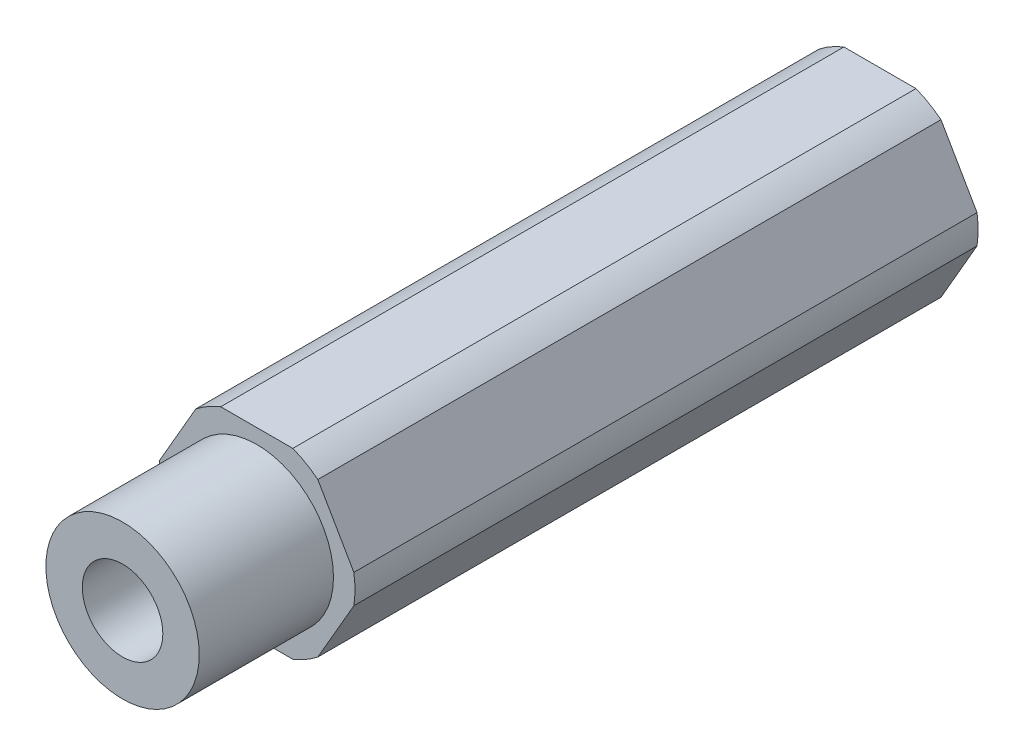
ISO-10303-21;
HEADER;
FILE_DESCRIPTION(('STEP AP214'),'2;1');
FILE_NAME('part.step','',(''),(''),'','','');
FILE_SCHEMA(('AUTOMOTIVE_DESIGN { 1 0 10303 214 1 1 1 1 }'));
ENDSEC;
DATA;
#1=APPLICATION_CONTEXT('core data for automotive mechanical design processes');
#2=APPLICATION_PROTOCOL_DEFINITION('international standard','automotive_design',2000,#1);
#3=PRODUCT_CONTEXT('',#1,'mechanical');
#4=PRODUCT('Part','Part','',(#3));
#5=PRODUCT_RELATED_PRODUCT_CATEGORY('part','',(#4));
#6=PRODUCT_DEFINITION_FORMATION('','',#4);
#7=PRODUCT_DEFINITION_CONTEXT('part definition',#1,'design');
#8=PRODUCT_DEFINITION('design','',#6,#7);
#9=PRODUCT_DEFINITION_SHAPE('','',#8);
#10=(LENGTH_UNIT() NAMED_UNIT(*) SI_UNIT(.MILLI.,.METRE.));
#11=(NAMED_UNIT(*) PLANE_ANGLE_UNIT() SI_UNIT($,.RADIAN.));
#12=(NAMED_UNIT(*) SI_UNIT($,.STERADIAN.) SOLID_ANGLE_UNIT());
#13=UNCERTAINTY_MEASURE_WITH_UNIT(LENGTH_MEASURE(1.E-05),#10,'distance_accuracy_value','');
#14=(GEOMETRIC_REPRESENTATION_CONTEXT(3) GLOBAL_UNCERTAINTY_ASSIGNED_CONTEXT((#13)) GLOBAL_UNIT_ASSIGNED_CONTEXT((#10,
#11,#12)) REPRESENTATION_CONTEXT('',''));
#15=CARTESIAN_POINT('',(0.,0.,0.));
#16=DIRECTION('',(0.,0.,1.));
#17=DIRECTION('',(1.,0.,0.));
#18=AXIS2_PLACEMENT_3D('',#15,#16,#17);
#19=CARTESIAN_POINT('',(0.,0.,39.5));
#20=DIRECTION('',(0.,0.,1.));
#21=DIRECTION('',(1.,0.,0.));
#22=AXIS2_PLACEMENT_3D('',#19,#20,#21);
#23=PLANE('',#22);
#24=CARTESIAN_POINT('',(0.,0.,39.5));
#25=DIRECTION('',(0.,0.,1.));
#26=DIRECTION('',(1.,0.,0.));
#27=AXIS2_PLACEMENT_3D('',#24,#25,#26);
#28=CIRCLE('',#27,2.1);
#29=CARTESIAN_POINT('',(2.1,0.,39.5));
#30=VERTEX_POINT('',#29);
#31=EDGE_CURVE('E234',#30,#30,#28,.F.);
#32=ORIENTED_EDGE('',*,*,#31,.T.);
#33=EDGE_LOOP('',(#32));
#34=FACE_BOUND('',#33,.T.);
#35=CARTESIAN_POINT('',(0.,0.,39.5));
#36=DIRECTION('',(0.,0.,1.));
#37=DIRECTION('',(1.,0.,0.));
#38=AXIS2_PLACEMENT_3D('',#35,#36,#37);
#39=CIRCLE('',#38,4.);
#40=CARTESIAN_POINT('',(4.,0.,39.5));
#41=VERTEX_POINT('',#40);
#42=EDGE_CURVE('E279',#41,#41,#39,.T.);
#43=ORIENTED_EDGE('',*,*,#42,.T.);
#44=EDGE_LOOP('',(#43));
#45=FACE_BOUND('',#44,.T.);
#46=ADVANCED_FACE('F56',(#34,#45),#23,.T.);
#47=CARTESIAN_POINT('',(0.,0.,-457.2));
#48=DIRECTION('',(0.,0.,1.));
#49=DIRECTION('',(1.,0.,0.));
#50=AXIS2_PLACEMENT_3D('',#47,#48,#49);
#51=CYLINDRICAL_SURFACE('',#50,5.12);
#52=DIRECTION('',(0.,0.,1.));
#53=VECTOR('',#52,1.);
#54=CARTESIAN_POINT('',(5.06425896558911,0.753446168913412,-457.2));
#55=LINE('',#54,#53);
#56=CARTESIAN_POINT('',(5.06425896558911,0.753446168913412,0.));
#57=VERTEX_POINT('',#56);
#58=CARTESIAN_POINT('',(5.06425896558912,0.753446168913413,32.5));
#59=VERTEX_POINT('',#58);
#60=EDGE_CURVE('E164',#57,#59,#55,.T.);
#61=ORIENTED_EDGE('',*,*,#60,.T.);
#62=CARTESIAN_POINT('',(0.,0.,32.5));
#63=DIRECTION('',(0.,0.,1.));
#64=DIRECTION('',(1.,0.,0.));
#65=AXIS2_PLACEMENT_3D('',#62,#63,#64);
#66=CIRCLE('',#65,5.12000000000001);
#67=CARTESIAN_POINT('',(5.0642589655891,-0.753446168913538,32.5));
#68=VERTEX_POINT('',#67);
#69=EDGE_CURVE('E145',#68,#59,#66,.T.);
#70=ORIENTED_EDGE('',*,*,#69,.F.);
#71=DIRECTION('',(0.,0.,-1.));
#72=VECTOR('',#71,1.);
#73=CARTESIAN_POINT('',(5.06425896558911,-0.753446168913433,-457.2));
#74=LINE('',#73,#72);
#75=CARTESIAN_POINT('',(5.06425896558911,-0.753446168913433,0.));
#76=VERTEX_POINT('',#75);
#77=EDGE_CURVE('E65',#68,#76,#74,.T.);
#78=ORIENTED_EDGE('',*,*,#77,.T.);
#79=CARTESIAN_POINT('',(0.,0.,0.));
#80=DIRECTION('',(0.,0.,1.));
#81=DIRECTION('',(1.,0.,0.));
#82=AXIS2_PLACEMENT_3D('',#79,#80,#81);
#83=CIRCLE('',#82,5.12);
#84=EDGE_CURVE('E173',#57,#76,#83,.F.);
#85=ORIENTED_EDGE('',*,*,#84,.F.);
#86=EDGE_LOOP('',(#61,#70,#78,#85));
#87=FACE_BOUND('',#86,.T.);
#88=ADVANCED_FACE('F171',(#87),#51,.T.);
#89=CARTESIAN_POINT('',(0.,0.,-457.2));
#90=DIRECTION('',(0.,0.,1.));
#91=DIRECTION('',(1.,0.,0.));
#92=AXIS2_PLACEMENT_3D('',#89,#90,#91);
#93=CYLINDRICAL_SURFACE('',#92,5.12);
#94=DIRECTION('',(0.,0.,1.));
#95=VECTOR('',#94,1.);
#96=CARTESIAN_POINT('',(3.1846330054577,-4.00905383108652,-457.2));
#97=LINE('',#96,#95);
#98=CARTESIAN_POINT('',(3.1846330054577,-4.00905383108652,0.));
#99=VERTEX_POINT('',#98);
#100=CARTESIAN_POINT('',(3.18463300545775,-4.00905383108648,32.5));
#101=VERTEX_POINT('',#100);
#102=EDGE_CURVE('E175',#99,#101,#97,.T.);
#103=ORIENTED_EDGE('',*,*,#102,.T.);
#104=CARTESIAN_POINT('',(1.87962596013157,-4.76249999999995,32.5));
#105=VERTEX_POINT('',#104);
#106=EDGE_CURVE('E156',#105,#101,#66,.T.);
#107=ORIENTED_EDGE('',*,*,#106,.F.);
#108=DIRECTION('',(0.,0.,-1.));
#109=VECTOR('',#108,1.);
#110=CARTESIAN_POINT('',(1.87962596013154,-4.7625,-457.2));
#111=LINE('',#110,#109);
#112=CARTESIAN_POINT('',(1.87962596013154,-4.7625,0.));
#113=VERTEX_POINT('',#112);
#114=EDGE_CURVE('E208',#105,#113,#111,.T.);
#115=ORIENTED_EDGE('',*,*,#114,.T.);
#116=CARTESIAN_POINT('',(0.,0.,0.));
#117=DIRECTION('',(0.,0.,1.));
#118=DIRECTION('',(1.,0.,0.));
#119=AXIS2_PLACEMENT_3D('',#116,#117,#118);
#120=CIRCLE('',#119,5.12);
#121=EDGE_CURVE('E214',#99,#113,#120,.F.);
#122=ORIENTED_EDGE('',*,*,#121,.F.);
#123=EDGE_LOOP('',(#103,#107,#115,#122));
#124=FACE_BOUND('',#123,.T.);
#125=ADVANCED_FACE('F297',(#124),#93,.T.);
#126=CARTESIAN_POINT('',(0.,0.,-457.2));
#127=DIRECTION('',(0.,0.,1.));
#128=DIRECTION('',(1.,0.,0.));
#129=AXIS2_PLACEMENT_3D('',#126,#127,#128);
#130=CYLINDRICAL_SURFACE('',#129,5.12);
#131=DIRECTION('',(0.,0.,1.));
#132=VECTOR('',#131,1.);
#133=CARTESIAN_POINT('',(-1.87962596013144,-4.7625,-457.2));
#134=LINE('',#133,#132);
#135=CARTESIAN_POINT('',(-1.87962596013144,-4.7625,0.));
#136=VERTEX_POINT('',#135);
#137=CARTESIAN_POINT('',(-1.87962596013144,-4.7625,32.5));
#138=VERTEX_POINT('',#137);
#139=EDGE_CURVE('E204',#136,#138,#134,.T.);
#140=ORIENTED_EDGE('',*,*,#139,.T.);
#141=CARTESIAN_POINT('',(-3.1846330054576,-4.0090538310866,32.5));
#142=VERTEX_POINT('',#141);
#143=EDGE_CURVE('E71',#142,#138,#66,.T.);
#144=ORIENTED_EDGE('',*,*,#143,.F.);
#145=DIRECTION('',(0.,0.,-1.));
#146=VECTOR('',#145,1.);
#147=CARTESIAN_POINT('',(-3.1846330054576,-4.0090538310866,-457.2));
#148=LINE('',#147,#146);
#149=CARTESIAN_POINT('',(-3.1846330054576,-4.0090538310866,0.));
#150=VERTEX_POINT('',#149);
#151=EDGE_CURVE('E201',#142,#150,#148,.T.);
#152=ORIENTED_EDGE('',*,*,#151,.T.);
#153=CARTESIAN_POINT('',(0.,0.,0.));
#154=DIRECTION('',(0.,0.,1.));
#155=DIRECTION('',(1.,0.,0.));
#156=AXIS2_PLACEMENT_3D('',#153,#154,#155);
#157=CIRCLE('',#156,5.12);
#158=EDGE_CURVE('E218',#136,#150,#157,.F.);
#159=ORIENTED_EDGE('',*,*,#158,.F.);
#160=EDGE_LOOP('',(#140,#144,#152,#159));
#161=FACE_BOUND('',#160,.T.);
#162=ADVANCED_FACE('F304',(#161),#130,.T.);
#163=CARTESIAN_POINT('',(0.,0.,-457.2));
#164=DIRECTION('',(0.,0.,1.));
#165=DIRECTION('',(1.,0.,0.));
#166=AXIS2_PLACEMENT_3D('',#163,#164,#165);
#167=CYLINDRICAL_SURFACE('',#166,5.12);
#168=DIRECTION('',(0.,0.,1.));
#169=VECTOR('',#168,1.);
#170=CARTESIAN_POINT('',(-5.06425896558911,-0.75344616891345,-457.2));
#171=LINE('',#170,#169);
#172=CARTESIAN_POINT('',(-5.06425896558911,-0.75344616891345,0.));
#173=VERTEX_POINT('',#172);
#174=CARTESIAN_POINT('',(-5.06425896558911,-0.753446168913447,32.5));
#175=VERTEX_POINT('',#174);
#176=EDGE_CURVE('E197',#173,#175,#171,.T.);
#177=ORIENTED_EDGE('',*,*,#176,.T.);
#178=CARTESIAN_POINT('',(-5.06425896558911,0.753446168913459,32.5));
#179=VERTEX_POINT('',#178);
#180=EDGE_CURVE('E277',#179,#175,#66,.T.);
#181=ORIENTED_EDGE('',*,*,#180,.F.);
#182=DIRECTION('',(0.,0.,-1.));
#183=VECTOR('',#182,1.);
#184=CARTESIAN_POINT('',(-5.06425896558912,0.753446168913382,-457.2));
#185=LINE('',#184,#183);
#186=CARTESIAN_POINT('',(-5.06425896558912,0.753446168913382,0.));
#187=VERTEX_POINT('',#186);
#188=EDGE_CURVE('E194',#179,#187,#185,.T.);
#189=ORIENTED_EDGE('',*,*,#188,.T.);
#190=CARTESIAN_POINT('',(0.,0.,0.));
#191=DIRECTION('',(0.,0.,1.));
#192=DIRECTION('',(1.,0.,0.));
#193=AXIS2_PLACEMENT_3D('',#190,#191,#192);
#194=CIRCLE('',#193,5.12);
#195=EDGE_CURVE('E222',#173,#187,#194,.F.);
#196=ORIENTED_EDGE('',*,*,#195,.F.);
#197=EDGE_LOOP('',(#177,#181,#189,#196));
#198=FACE_BOUND('',#197,.T.);
#199=ADVANCED_FACE('F312',(#198),#167,.T.);
#200=CARTESIAN_POINT('',(0.,0.,-457.2));
#201=DIRECTION('',(0.,0.,1.));
#202=DIRECTION('',(1.,0.,0.));
#203=AXIS2_PLACEMENT_3D('',#200,#201,#202);
#204=CYLINDRICAL_SURFACE('',#203,5.12);
#205=DIRECTION('',(0.,0.,1.));
#206=VECTOR('',#205,1.);
#207=CARTESIAN_POINT('',(-3.18463300545766,4.00905383108655,-457.2));
#208=LINE('',#207,#206);
#209=CARTESIAN_POINT('',(-3.18463300545766,4.00905383108655,0.));
#210=VERTEX_POINT('',#209);
#211=CARTESIAN_POINT('',(-3.18463300545769,4.00905383108653,32.5));
#212=VERTEX_POINT('',#211);
#213=EDGE_CURVE('E190',#210,#212,#208,.T.);
#214=ORIENTED_EDGE('',*,*,#213,.T.);
#215=CARTESIAN_POINT('',(-1.87962596013149,4.76249999999998,32.5));
#216=VERTEX_POINT('',#215);
#217=EDGE_CURVE('E272',#216,#212,#66,.T.);
#218=ORIENTED_EDGE('',*,*,#217,.F.);
#219=DIRECTION('',(0.,0.,-1.));
#220=VECTOR('',#219,1.);
#221=CARTESIAN_POINT('',(-1.8796259601315,4.7625,-457.2));
#222=LINE('',#221,#220);
#223=CARTESIAN_POINT('',(-1.8796259601315,4.7625,0.));
#224=VERTEX_POINT('',#223);
#225=EDGE_CURVE('E187',#216,#224,#222,.T.);
#226=ORIENTED_EDGE('',*,*,#225,.T.);
#227=CARTESIAN_POINT('',(0.,0.,0.));
#228=DIRECTION('',(0.,0.,1.));
#229=DIRECTION('',(1.,0.,0.));
#230=AXIS2_PLACEMENT_3D('',#227,#228,#229);
#231=CIRCLE('',#230,5.12);
#232=EDGE_CURVE('E226',#210,#224,#231,.F.);
#233=ORIENTED_EDGE('',*,*,#232,.F.);
#234=EDGE_LOOP('',(#214,#218,#226,#233));
#235=FACE_BOUND('',#234,.T.);
#236=ADVANCED_FACE('F320',(#235),#204,.T.);
#237=CARTESIAN_POINT('',(0.,0.,-457.2));
#238=DIRECTION('',(0.,0.,1.));
#239=DIRECTION('',(1.,0.,0.));
#240=AXIS2_PLACEMENT_3D('',#237,#238,#239);
#241=CYLINDRICAL_SURFACE('',#240,5.12);
#242=DIRECTION('',(0.,0.,1.));
#243=VECTOR('',#242,1.);
#244=CARTESIAN_POINT('',(1.87962596013147,4.7625,-457.2));
#245=LINE('',#244,#243);
#246=CARTESIAN_POINT('',(1.87962596013147,4.7625,0.));
#247=VERTEX_POINT('',#246);
#248=CARTESIAN_POINT('',(1.87962596013145,4.7625,32.5));
#249=VERTEX_POINT('',#248);
#250=EDGE_CURVE('E79',#247,#249,#245,.T.);
#251=ORIENTED_EDGE('',*,*,#250,.T.);
#252=CARTESIAN_POINT('',(3.18463300545763,4.00905383108658,32.5));
#253=VERTEX_POINT('',#252);
#254=EDGE_CURVE('E159',#253,#249,#66,.T.);
#255=ORIENTED_EDGE('',*,*,#254,.F.);
#256=DIRECTION('',(0.,0.,-1.));
#257=VECTOR('',#256,1.);
#258=CARTESIAN_POINT('',(3.18463300545762,4.00905383108658,-457.2));
#259=LINE('',#258,#257);
#260=CARTESIAN_POINT('',(3.18463300545762,4.00905383108658,0.));
#261=VERTEX_POINT('',#260);
#262=EDGE_CURVE('E166',#253,#261,#259,.T.);
#263=ORIENTED_EDGE('',*,*,#262,.T.);
#264=CARTESIAN_POINT('',(0.,0.,0.));
#265=DIRECTION('',(0.,0.,1.));
#266=DIRECTION('',(1.,0.,0.));
#267=AXIS2_PLACEMENT_3D('',#264,#265,#266);
#268=CIRCLE('',#267,5.12);
#269=EDGE_CURVE('E230',#247,#261,#268,.F.);
#270=ORIENTED_EDGE('',*,*,#269,.F.);
#271=EDGE_LOOP('',(#251,#255,#263,#270));
#272=FACE_BOUND('',#271,.T.);
#273=ADVANCED_FACE('F58',(#272),#241,.T.);
#274=CARTESIAN_POINT('',(2.74963065701564,-4.7625,457.2));
#275=DIRECTION('',(-0.866025403784442,0.5,0.));
#276=DIRECTION('',(0.,0.,1.));
#277=AXIS2_PLACEMENT_3D('',#274,#275,#276);
#278=PLANE('',#277);
#279=DIRECTION('',(0.499999999999999,0.866025403784439,0.));
#280=VECTOR('',#279,1.);
#281=CARTESIAN_POINT('',(2.74963065701564,-4.7625,32.5));
#282=LINE('',#281,#280);
#283=EDGE_CURVE('E151',#101,#68,#282,.T.);
#284=ORIENTED_EDGE('',*,*,#283,.F.);
#285=ORIENTED_EDGE('',*,*,#102,.F.);
#286=DIRECTION('',(0.499999999999991,0.866025403784444,0.));
#287=VECTOR('',#286,1.);
#288=CARTESIAN_POINT('',(3.18463300545771,-4.00905383108654,0.));
#289=LINE('',#288,#287);
#290=EDGE_CURVE('E253',#99,#76,#289,.T.);
#291=ORIENTED_EDGE('',*,*,#290,.T.);
#292=ORIENTED_EDGE('',*,*,#77,.F.);
#293=EDGE_LOOP('',(#284,#285,#291,#292));
#294=FACE_BOUND('',#293,.T.);
#295=ADVANCED_FACE('F293',(#294),#278,.F.);
#296=CARTESIAN_POINT('',(5.49926131403117,0.,457.2));
#297=DIRECTION('',(-0.866025403784438,-0.5,0.));
#298=DIRECTION('',(-0.5,0.866025403784438,0.));
#299=AXIS2_PLACEMENT_3D('',#296,#297,#298);
#300=PLANE('',#299);
#301=DIRECTION('',(-0.5,0.866025403784438,0.));
#302=VECTOR('',#301,1.);
#303=CARTESIAN_POINT('',(5.49926131403117,0.,32.5));
#304=LINE('',#303,#302);
#305=EDGE_CURVE('E148',#59,#253,#304,.T.);
#306=ORIENTED_EDGE('',*,*,#305,.F.);
#307=ORIENTED_EDGE('',*,*,#60,.F.);
#308=DIRECTION('',(-0.500000000000001,0.866025403784438,0.));
#309=VECTOR('',#308,1.);
#310=CARTESIAN_POINT('',(5.06425896558911,0.753446168913416,0.));
#311=LINE('',#310,#309);
#312=EDGE_CURVE('E250',#57,#261,#311,.T.);
#313=ORIENTED_EDGE('',*,*,#312,.T.);
#314=ORIENTED_EDGE('',*,*,#262,.F.);
#315=EDGE_LOOP('',(#306,#307,#313,#314));
#316=FACE_BOUND('',#315,.T.);
#317=ADVANCED_FACE('F162',(#316),#300,.F.);
#318=CARTESIAN_POINT('',(2.74963065701557,4.7625,457.2));
#319=DIRECTION('',(0.,-1.,0.));
#320=DIRECTION('',(0.,0.,-1.));
#321=AXIS2_PLACEMENT_3D('',#318,#319,#320);
#322=PLANE('',#321);
#323=DIRECTION('',(-1.,0.,0.));
#324=VECTOR('',#323,1.);
#325=CARTESIAN_POINT('',(2.74963065701557,4.7625,32.5));
#326=LINE('',#325,#324);
#327=EDGE_CURVE('E168',#249,#216,#326,.T.);
#328=ORIENTED_EDGE('',*,*,#327,.F.);
#329=ORIENTED_EDGE('',*,*,#250,.F.);
#330=DIRECTION('',(-1.,0.,0.));
#331=VECTOR('',#330,1.);
#332=CARTESIAN_POINT('',(1.87962596013146,4.76249999999999,0.));
#333=LINE('',#332,#331);
#334=EDGE_CURVE('E247',#247,#224,#333,.T.);
#335=ORIENTED_EDGE('',*,*,#334,.T.);
#336=ORIENTED_EDGE('',*,*,#225,.F.);
#337=EDGE_LOOP('',(#328,#329,#335,#336));
#338=FACE_BOUND('',#337,.T.);
#339=ADVANCED_FACE('F323',(#338),#322,.F.);
#340=CARTESIAN_POINT('',(-2.7496306570156,4.7625,457.2));
#341=DIRECTION('',(0.866025403784442,-0.5,0.));
#342=DIRECTION('',(0.,0.,-1.));
#343=AXIS2_PLACEMENT_3D('',#340,#341,#342);
#344=PLANE('',#343);
#345=DIRECTION('',(-0.499999999999999,-0.866025403784439,0.));
#346=VECTOR('',#345,1.);
#347=CARTESIAN_POINT('',(-2.7496306570156,4.7625,32.5));
#348=LINE('',#347,#346);
#349=EDGE_CURVE('E275',#212,#179,#348,.T.);
#350=ORIENTED_EDGE('',*,*,#349,.F.);
#351=ORIENTED_EDGE('',*,*,#213,.F.);
#352=DIRECTION('',(-0.499999999999993,-0.866025403784443,0.));
#353=VECTOR('',#352,1.);
#354=CARTESIAN_POINT('',(-3.18463300545766,4.00905383108656,0.));
#355=LINE('',#354,#353);
#356=EDGE_CURVE('E243',#210,#187,#355,.T.);
#357=ORIENTED_EDGE('',*,*,#356,.T.);
#358=ORIENTED_EDGE('',*,*,#188,.F.);
#359=EDGE_LOOP('',(#350,#351,#357,#358));
#360=FACE_BOUND('',#359,.T.);
#361=ADVANCED_FACE('F317',(#360),#344,.F.);
#362=CARTESIAN_POINT('',(-5.49926131403117,0.,457.2));
#363=DIRECTION('',(0.866025403784435,0.500000000000007,0.));
#364=DIRECTION('',(0.,0.,-1.));
#365=AXIS2_PLACEMENT_3D('',#362,#363,#364);
#366=PLANE('',#365);
#367=DIRECTION('',(0.500000000000007,-0.866025403784435,0.));
#368=VECTOR('',#367,1.);
#369=CARTESIAN_POINT('',(-5.49926131403117,0.,32.5));
#370=LINE('',#369,#368);
#371=EDGE_CURVE('E271',#175,#142,#370,.T.);
#372=ORIENTED_EDGE('',*,*,#371,.F.);
#373=ORIENTED_EDGE('',*,*,#176,.F.);
#374=DIRECTION('',(0.500000000000007,-0.866025403784435,0.));
#375=VECTOR('',#374,1.);
#376=CARTESIAN_POINT('',(-5.06425896558911,-0.753446168913448,0.));
#377=LINE('',#376,#375);
#378=EDGE_CURVE('E239',#173,#150,#377,.T.);
#379=ORIENTED_EDGE('',*,*,#378,.T.);
#380=ORIENTED_EDGE('',*,*,#151,.F.);
#381=EDGE_LOOP('',(#372,#373,#379,#380));
#382=FACE_BOUND('',#381,.T.);
#383=ADVANCED_FACE('F308',(#382),#366,.F.);
#384=CARTESIAN_POINT('',(-2.74963065701554,-4.7625,457.2));
#385=DIRECTION('',(0.,1.,0.));
#386=DIRECTION('',(1.,0.,0.));
#387=AXIS2_PLACEMENT_3D('',#384,#385,#386);
#388=PLANE('',#387);
#389=DIRECTION('',(1.,0.,0.));
#390=VECTOR('',#389,1.);
#391=CARTESIAN_POINT('',(-2.74963065701554,-4.7625,32.5));
#392=LINE('',#391,#390);
#393=EDGE_CURVE('E12',#138,#105,#392,.T.);
#394=ORIENTED_EDGE('',*,*,#393,.F.);
#395=ORIENTED_EDGE('',*,*,#139,.F.);
#396=DIRECTION('',(1.,0.,0.));
#397=VECTOR('',#396,1.);
#398=CARTESIAN_POINT('',(-1.87962596013144,-4.7625,0.));
#399=LINE('',#398,#397);
#400=EDGE_CURVE('E235',#136,#113,#399,.T.);
#401=ORIENTED_EDGE('',*,*,#400,.T.);
#402=ORIENTED_EDGE('',*,*,#114,.F.);
#403=EDGE_LOOP('',(#394,#395,#401,#402));
#404=FACE_BOUND('',#403,.T.);
#405=ADVANCED_FACE('F265',(#404),#388,.F.);
#406=CARTESIAN_POINT('',(0.,0.,0.));
#407=DIRECTION('',(0.,0.,1.));
#408=DIRECTION('',(1.,0.,0.));
#409=AXIS2_PLACEMENT_3D('',#406,#407,#408);
#410=PLANE('',#409);
#411=CARTESIAN_POINT('',(0.,0.,0.));
#412=DIRECTION('',(0.,0.,1.));
#413=DIRECTION('',(1.,0.,0.));
#414=AXIS2_PLACEMENT_3D('',#411,#412,#413);
#415=CIRCLE('',#414,2.1);
#416=CARTESIAN_POINT('',(2.1,0.,0.));
#417=VERTEX_POINT('',#416);
#418=EDGE_CURVE('E211',#417,#417,#415,.F.);
#419=ORIENTED_EDGE('',*,*,#418,.F.);
#420=EDGE_LOOP('',(#419));
#421=FACE_BOUND('',#420,.T.);
#422=ORIENTED_EDGE('',*,*,#312,.F.);
#423=ORIENTED_EDGE('',*,*,#84,.T.);
#424=ORIENTED_EDGE('',*,*,#290,.F.);
#425=ORIENTED_EDGE('',*,*,#121,.T.);
#426=ORIENTED_EDGE('',*,*,#400,.F.);
#427=ORIENTED_EDGE('',*,*,#158,.T.);
#428=ORIENTED_EDGE('',*,*,#378,.F.);
#429=ORIENTED_EDGE('',*,*,#195,.T.);
#430=ORIENTED_EDGE('',*,*,#356,.F.);
#431=ORIENTED_EDGE('',*,*,#232,.T.);
#432=ORIENTED_EDGE('',*,*,#334,.F.);
#433=ORIENTED_EDGE('',*,*,#269,.T.);
#434=EDGE_LOOP('',(#422,#423,#424,#425,#426,#427,#428,#429,#430,#431,#432,#433));
#435=FACE_BOUND('',#434,.T.);
#436=ADVANCED_FACE('F262',(#421,#435),#410,.F.);
#437=CARTESIAN_POINT('',(0.,0.,-457.2));
#438=DIRECTION('',(0.,0.,1.));
#439=DIRECTION('',(1.,0.,0.));
#440=AXIS2_PLACEMENT_3D('',#437,#438,#439);
#441=CYLINDRICAL_SURFACE('',#440,2.1);
#442=ORIENTED_EDGE('',*,*,#31,.F.);
#443=EDGE_LOOP('',(#442));
#444=FACE_BOUND('',#443,.T.);
#445=ORIENTED_EDGE('',*,*,#418,.T.);
#446=EDGE_LOOP('',(#445));
#447=FACE_BOUND('',#446,.T.);
#448=ADVANCED_FACE('F260',(#444,#447),#441,.F.);
#449=CARTESIAN_POINT('',(0.,0.,32.5));
#450=DIRECTION('',(0.,0.,1.));
#451=DIRECTION('',(1.,0.,0.));
#452=AXIS2_PLACEMENT_3D('',#449,#450,#451);
#453=PLANE('',#452);
#454=CARTESIAN_POINT('',(0.,0.,32.5));
#455=DIRECTION('',(0.,0.,1.));
#456=DIRECTION('',(1.,0.,0.));
#457=AXIS2_PLACEMENT_3D('',#454,#455,#456);
#458=CIRCLE('',#457,4.);
#459=CARTESIAN_POINT('',(4.,0.,32.5));
#460=VERTEX_POINT('',#459);
#461=EDGE_CURVE('E157',#460,#460,#458,.T.);
#462=ORIENTED_EDGE('',*,*,#461,.F.);
#463=EDGE_LOOP('',(#462));
#464=FACE_BOUND('',#463,.T.);
#465=ORIENTED_EDGE('',*,*,#283,.T.);
#466=ORIENTED_EDGE('',*,*,#69,.T.);
#467=ORIENTED_EDGE('',*,*,#305,.T.);
#468=ORIENTED_EDGE('',*,*,#254,.T.);
#469=ORIENTED_EDGE('',*,*,#327,.T.);
#470=ORIENTED_EDGE('',*,*,#217,.T.);
#471=ORIENTED_EDGE('',*,*,#349,.T.);
#472=ORIENTED_EDGE('',*,*,#180,.T.);
#473=ORIENTED_EDGE('',*,*,#371,.T.);
#474=ORIENTED_EDGE('',*,*,#143,.T.);
#475=ORIENTED_EDGE('',*,*,#393,.T.);
#476=ORIENTED_EDGE('',*,*,#106,.T.);
#477=EDGE_LOOP('',(#465,#466,#467,#468,#469,#470,#471,#472,#473,#474,#475,#476));
#478=FACE_BOUND('',#477,.T.);
#479=ADVANCED_FACE('F147',(#464,#478),#453,.T.);
#480=CARTESIAN_POINT('',(0.,0.,32.5));
#481=DIRECTION('',(0.,0.,1.));
#482=DIRECTION('',(1.,0.,0.));
#483=AXIS2_PLACEMENT_3D('',#480,#481,#482);
#484=CYLINDRICAL_SURFACE('',#483,4.);
#485=ORIENTED_EDGE('',*,*,#461,.T.);
#486=EDGE_LOOP('',(#485));
#487=FACE_BOUND('',#486,.T.);
#488=ORIENTED_EDGE('',*,*,#42,.F.);
#489=EDGE_LOOP('',(#488));
#490=FACE_BOUND('',#489,.T.);
#491=ADVANCED_FACE('F343',(#487,#490),#484,.T.);
#492=CLOSED_SHELL('',(#46,#88,#125,#162,#199,#236,#273,#295,#317,#339,#361,#383,#405,#436,#448,
#479,#491));
#493=MANIFOLD_SOLID_BREP('B2',#492);
#494=ADVANCED_BREP_SHAPE_REPRESENTATION('',(#18,#493),#14);
#495=SHAPE_DEFINITION_REPRESENTATION(#9,#494);
ENDSEC;
END-ISO-10303-21;
